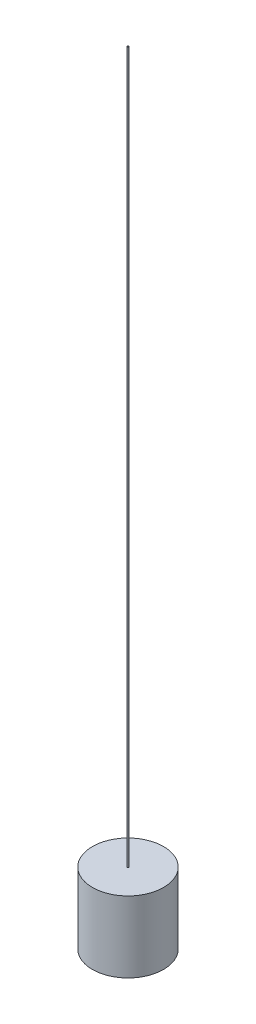
ISO-10303-21;
HEADER;
FILE_DESCRIPTION(('STEP AP214'),'2;1');
FILE_NAME('part.step','',(''),(''),'','','');
FILE_SCHEMA(('AUTOMOTIVE_DESIGN { 1 0 10303 214 1 1 1 1 }'));
ENDSEC;
DATA;
#1=APPLICATION_CONTEXT('core data for automotive mechanical design processes');
#2=APPLICATION_PROTOCOL_DEFINITION('international standard','automotive_design',2000,#1);
#3=PRODUCT_CONTEXT('',#1,'mechanical');
#4=PRODUCT('Part','Part','',(#3));
#5=PRODUCT_RELATED_PRODUCT_CATEGORY('part','',(#4));
#6=PRODUCT_DEFINITION_FORMATION('','',#4);
#7=PRODUCT_DEFINITION_CONTEXT('part definition',#1,'design');
#8=PRODUCT_DEFINITION('design','',#6,#7);
#9=PRODUCT_DEFINITION_SHAPE('','',#8);
#10=(LENGTH_UNIT() NAMED_UNIT(*) SI_UNIT(.MILLI.,.METRE.));
#11=(NAMED_UNIT(*) PLANE_ANGLE_UNIT() SI_UNIT($,.RADIAN.));
#12=(NAMED_UNIT(*) SI_UNIT($,.STERADIAN.) SOLID_ANGLE_UNIT());
#13=UNCERTAINTY_MEASURE_WITH_UNIT(LENGTH_MEASURE(1.E-05),#10,'distance_accuracy_value','');
#14=(GEOMETRIC_REPRESENTATION_CONTEXT(3) GLOBAL_UNCERTAINTY_ASSIGNED_CONTEXT((#13)) GLOBAL_UNIT_ASSIGNED_CONTEXT((#10,
#11,#12)) REPRESENTATION_CONTEXT('',''));
#15=CARTESIAN_POINT('',(0.,0.,0.));
#16=DIRECTION('',(0.,0.,1.));
#17=DIRECTION('',(1.,0.,0.));
#18=AXIS2_PLACEMENT_3D('',#15,#16,#17);
#19=CARTESIAN_POINT('',(0.,-1000.,0.));
#20=DIRECTION('',(0.,1.,0.));
#21=DIRECTION('',(0.,0.,1.));
#22=AXIS2_PLACEMENT_3D('',#19,#20,#21);
#23=PLANE('',#22);
#24=CARTESIAN_POINT('',(0.,-1000.,0.));
#25=DIRECTION('',(0.,1.,0.));
#26=DIRECTION('',(0.,0.,1.));
#27=AXIS2_PLACEMENT_3D('',#24,#25,#26);
#28=CIRCLE('',#27,500.);
#29=CARTESIAN_POINT('',(0.,-1000.,500.));
#30=VERTEX_POINT('',#29);
#31=EDGE_CURVE('E55',#30,#30,#28,.T.);
#32=ORIENTED_EDGE('',*,*,#31,.F.);
#33=EDGE_LOOP('',(#32));
#34=FACE_BOUND('',#33,.T.);
#35=ADVANCED_FACE('F42',(#34),#23,.F.);
#36=CARTESIAN_POINT('',(0.,0.,0.));
#37=DIRECTION('',(0.,1.,0.));
#38=DIRECTION('',(0.,0.,1.));
#39=AXIS2_PLACEMENT_3D('',#36,#37,#38);
#40=CYLINDRICAL_SURFACE('',#39,500.);
#41=ORIENTED_EDGE('',*,*,#31,.T.);
#42=EDGE_LOOP('',(#41));
#43=FACE_BOUND('',#42,.T.);
#44=CARTESIAN_POINT('',(0.,0.,0.));
#45=DIRECTION('',(0.,1.,0.));
#46=DIRECTION('',(0.,0.,1.));
#47=AXIS2_PLACEMENT_3D('',#44,#45,#46);
#48=CIRCLE('',#47,500.);
#49=CARTESIAN_POINT('',(0.,0.,500.));
#50=VERTEX_POINT('',#49);
#51=EDGE_CURVE('E51',#50,#50,#48,.T.);
#52=ORIENTED_EDGE('',*,*,#51,.F.);
#53=EDGE_LOOP('',(#52));
#54=FACE_BOUND('',#53,.T.);
#55=ADVANCED_FACE('F75',(#43,#54),#40,.T.);
#56=CARTESIAN_POINT('',(0.,0.,0.));
#57=DIRECTION('',(0.,1.,0.));
#58=DIRECTION('',(0.,0.,1.));
#59=AXIS2_PLACEMENT_3D('',#56,#57,#58);
#60=PLANE('',#59);
#61=CARTESIAN_POINT('',(0.,0.,0.));
#62=DIRECTION('',(0.,1.,0.));
#63=DIRECTION('',(0.,0.,1.));
#64=AXIS2_PLACEMENT_3D('',#61,#62,#63);
#65=CIRCLE('',#64,10.);
#66=CARTESIAN_POINT('',(0.,0.,10.));
#67=VERTEX_POINT('',#66);
#68=EDGE_CURVE('E11',#67,#67,#65,.F.);
#69=ORIENTED_EDGE('',*,*,#68,.T.);
#70=EDGE_LOOP('',(#69));
#71=FACE_BOUND('',#70,.T.);
#72=ORIENTED_EDGE('',*,*,#51,.T.);
#73=EDGE_LOOP('',(#72));
#74=FACE_BOUND('',#73,.T.);
#75=ADVANCED_FACE('F72',(#71,#74),#60,.T.);
#76=CARTESIAN_POINT('',(0.,10000.,0.));
#77=DIRECTION('',(0.,1.,0.));
#78=DIRECTION('',(0.,0.,1.));
#79=AXIS2_PLACEMENT_3D('',#76,#77,#78);
#80=PLANE('',#79);
#81=CARTESIAN_POINT('',(0.,10000.,0.));
#82=DIRECTION('',(0.,1.,0.));
#83=DIRECTION('',(0.,0.,1.));
#84=AXIS2_PLACEMENT_3D('',#81,#82,#83);
#85=CIRCLE('',#84,10.);
#86=CARTESIAN_POINT('',(0.,10000.,10.));
#87=VERTEX_POINT('',#86);
#88=EDGE_CURVE('E46',#87,#87,#85,.T.);
#89=ORIENTED_EDGE('',*,*,#88,.T.);
#90=EDGE_LOOP('',(#89));
#91=FACE_BOUND('',#90,.T.);
#92=ADVANCED_FACE('F44',(#91),#80,.T.);
#93=CARTESIAN_POINT('',(0.,0.,0.));
#94=DIRECTION('',(0.,1.,0.));
#95=DIRECTION('',(0.,0.,1.));
#96=AXIS2_PLACEMENT_3D('',#93,#94,#95);
#97=CYLINDRICAL_SURFACE('',#96,10.);
#98=ORIENTED_EDGE('',*,*,#88,.F.);
#99=EDGE_LOOP('',(#98));
#100=FACE_BOUND('',#99,.T.);
#101=ORIENTED_EDGE('',*,*,#68,.F.);
#102=EDGE_LOOP('',(#101));
#103=FACE_BOUND('',#102,.T.);
#104=ADVANCED_FACE('F66',(#100,#103),#97,.T.);
#105=CLOSED_SHELL('',(#35,#55,#75,#92,#104));
#106=MANIFOLD_SOLID_BREP('B2',#105);
#107=ADVANCED_BREP_SHAPE_REPRESENTATION('',(#18,#106),#14);
#108=SHAPE_DEFINITION_REPRESENTATION(#9,#107);
ENDSEC;
END-ISO-10303-21;
